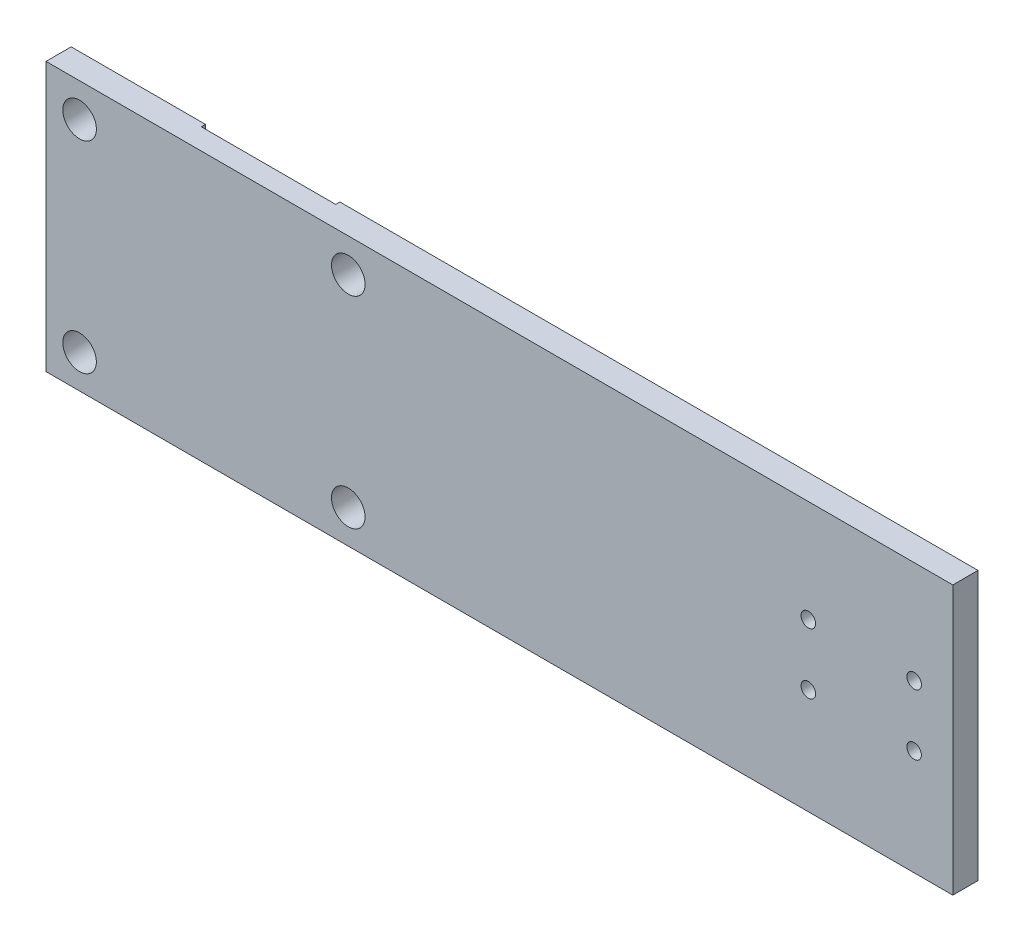
ISO-10303-21;
HEADER;
FILE_DESCRIPTION(('STEP AP214'),'2;1');
FILE_NAME('part.step','',(''),(''),'','','');
FILE_SCHEMA(('AUTOMOTIVE_DESIGN { 1 0 10303 214 1 1 1 1 }'));
ENDSEC;
DATA;
#1=APPLICATION_CONTEXT('core data for automotive mechanical design processes');
#2=APPLICATION_PROTOCOL_DEFINITION('international standard','automotive_design',2000,#1);
#3=PRODUCT_CONTEXT('',#1,'mechanical');
#4=PRODUCT('Part','Part','',(#3));
#5=PRODUCT_RELATED_PRODUCT_CATEGORY('part','',(#4));
#6=PRODUCT_DEFINITION_FORMATION('','',#4);
#7=PRODUCT_DEFINITION_CONTEXT('part definition',#1,'design');
#8=PRODUCT_DEFINITION('design','',#6,#7);
#9=PRODUCT_DEFINITION_SHAPE('','',#8);
#10=(LENGTH_UNIT() NAMED_UNIT(*) SI_UNIT(.MILLI.,.METRE.));
#11=(NAMED_UNIT(*) PLANE_ANGLE_UNIT() SI_UNIT($,.RADIAN.));
#12=(NAMED_UNIT(*) SI_UNIT($,.STERADIAN.) SOLID_ANGLE_UNIT());
#13=UNCERTAINTY_MEASURE_WITH_UNIT(LENGTH_MEASURE(1.E-05),#10,'distance_accuracy_value','');
#14=(GEOMETRIC_REPRESENTATION_CONTEXT(3) GLOBAL_UNCERTAINTY_ASSIGNED_CONTEXT((#13)) GLOBAL_UNIT_ASSIGNED_CONTEXT((#10,
#11,#12)) REPRESENTATION_CONTEXT('',''));
#15=CARTESIAN_POINT('',(0.,0.,0.));
#16=DIRECTION('',(0.,0.,1.));
#17=DIRECTION('',(1.,0.,0.));
#18=AXIS2_PLACEMENT_3D('',#15,#16,#17);
#19=CARTESIAN_POINT('',(0.,0.,9.525));
#20=DIRECTION('',(0.,0.,-1.));
#21=DIRECTION('',(-1.,0.,0.));
#22=AXIS2_PLACEMENT_3D('',#19,#20,#21);
#23=PLANE('',#22);
#24=CARTESIAN_POINT('',(328.2696,62.9412,9.525));
#25=DIRECTION('',(0.,0.,1.));
#26=DIRECTION('',(1.,0.,0.));
#27=AXIS2_PLACEMENT_3D('',#24,#25,#26);
#28=CIRCLE('',#27,2.74999999999997);
#29=CARTESIAN_POINT('',(331.0196,62.9412,9.525));
#30=VERTEX_POINT('',#29);
#31=EDGE_CURVE('E510',#30,#30,#28,.T.);
#32=ORIENTED_EDGE('',*,*,#31,.F.);
#33=EDGE_LOOP('',(#32));
#34=FACE_BOUND('',#33,.T.);
#35=CARTESIAN_POINT('',(328.2696,39.9288,9.525));
#36=DIRECTION('',(0.,0.,1.));
#37=DIRECTION('',(1.,0.,0.));
#38=AXIS2_PLACEMENT_3D('',#35,#36,#37);
#39=CIRCLE('',#38,2.74999999999997);
#40=CARTESIAN_POINT('',(331.0196,39.9288,9.525));
#41=VERTEX_POINT('',#40);
#42=EDGE_CURVE('E512',#41,#41,#39,.T.);
#43=ORIENTED_EDGE('',*,*,#42,.F.);
#44=EDGE_LOOP('',(#43));
#45=FACE_BOUND('',#44,.T.);
#46=CARTESIAN_POINT('',(288.2646,39.9288,9.525));
#47=DIRECTION('',(0.,0.,1.));
#48=DIRECTION('',(1.,0.,0.));
#49=AXIS2_PLACEMENT_3D('',#46,#47,#48);
#50=CIRCLE('',#49,2.74999999999997);
#51=CARTESIAN_POINT('',(291.0146,39.9288,9.525));
#52=VERTEX_POINT('',#51);
#53=EDGE_CURVE('E520',#52,#52,#50,.T.);
#54=ORIENTED_EDGE('',*,*,#53,.F.);
#55=EDGE_LOOP('',(#54));
#56=FACE_BOUND('',#55,.T.);
#57=CARTESIAN_POINT('',(12.7,12.7,9.525));
#58=DIRECTION('',(0.,0.,-1.));
#59=DIRECTION('',(1.,0.,0.));
#60=AXIS2_PLACEMENT_3D('',#57,#58,#59);
#61=CIRCLE('',#60,6.35);
#62=CARTESIAN_POINT('',(6.35000000000003,12.7,9.525));
#63=VERTEX_POINT('',#62);
#64=EDGE_CURVE('E210',#63,#63,#61,.T.);
#65=ORIENTED_EDGE('',*,*,#64,.T.);
#66=EDGE_LOOP('',(#65));
#67=FACE_BOUND('',#66,.T.);
#68=CARTESIAN_POINT('',(114.3,12.7,9.525));
#69=DIRECTION('',(0.,0.,-1.));
#70=DIRECTION('',(1.,0.,0.));
#71=AXIS2_PLACEMENT_3D('',#68,#69,#70);
#72=CIRCLE('',#71,6.35);
#73=CARTESIAN_POINT('',(107.95,12.7,9.525));
#74=VERTEX_POINT('',#73);
#75=EDGE_CURVE('E221',#74,#74,#72,.T.);
#76=ORIENTED_EDGE('',*,*,#75,.T.);
#77=EDGE_LOOP('',(#76));
#78=FACE_BOUND('',#77,.T.);
#79=CARTESIAN_POINT('',(114.3,88.9,9.525));
#80=DIRECTION('',(0.,0.,-1.));
#81=DIRECTION('',(-1.,0.,0.));
#82=AXIS2_PLACEMENT_3D('',#79,#80,#81);
#83=CIRCLE('',#82,6.34999999999999);
#84=CARTESIAN_POINT('',(107.95,88.9,9.525));
#85=VERTEX_POINT('',#84);
#86=EDGE_CURVE('E215',#85,#85,#83,.T.);
#87=ORIENTED_EDGE('',*,*,#86,.T.);
#88=EDGE_LOOP('',(#87));
#89=FACE_BOUND('',#88,.T.);
#90=CARTESIAN_POINT('',(12.7,88.9,9.525));
#91=DIRECTION('',(0.,0.,-1.));
#92=DIRECTION('',(-1.,0.,0.));
#93=AXIS2_PLACEMENT_3D('',#90,#91,#92);
#94=CIRCLE('',#93,6.35);
#95=CARTESIAN_POINT('',(6.35000000000004,88.9,9.525));
#96=VERTEX_POINT('',#95);
#97=EDGE_CURVE('E197',#96,#96,#94,.T.);
#98=ORIENTED_EDGE('',*,*,#97,.T.);
#99=EDGE_LOOP('',(#98));
#100=FACE_BOUND('',#99,.T.);
#101=DIRECTION('',(0.,-1.,0.));
#102=VECTOR('',#101,1.);
#103=CARTESIAN_POINT('',(0.,0.,9.525));
#104=LINE('',#103,#102);
#105=CARTESIAN_POINT('',(0.,101.6,9.525));
#106=VERTEX_POINT('',#105);
#107=CARTESIAN_POINT('',(0.,0.,9.525));
#108=VERTEX_POINT('',#107);
#109=EDGE_CURVE('E178',#106,#108,#104,.T.);
#110=ORIENTED_EDGE('',*,*,#109,.T.);
#111=DIRECTION('',(1.,0.,0.));
#112=VECTOR('',#111,1.);
#113=CARTESIAN_POINT('',(0.,0.,9.525));
#114=LINE('',#113,#112);
#115=CARTESIAN_POINT('',(342.9,0.,9.525));
#116=VERTEX_POINT('',#115);
#117=EDGE_CURVE('E92',#108,#116,#114,.T.);
#118=ORIENTED_EDGE('',*,*,#117,.T.);
#119=DIRECTION('',(0.,1.,0.));
#120=VECTOR('',#119,1.);
#121=CARTESIAN_POINT('',(342.9,0.,9.525));
#122=LINE('',#121,#120);
#123=CARTESIAN_POINT('',(342.9,101.6,9.525));
#124=VERTEX_POINT('',#123);
#125=EDGE_CURVE('E255',#116,#124,#122,.T.);
#126=ORIENTED_EDGE('',*,*,#125,.T.);
#127=DIRECTION('',(-1.,0.,0.));
#128=VECTOR('',#127,1.);
#129=CARTESIAN_POINT('',(0.,101.6,9.525));
#130=LINE('',#129,#128);
#131=EDGE_CURVE('E63',#124,#106,#130,.T.);
#132=ORIENTED_EDGE('',*,*,#131,.T.);
#133=EDGE_LOOP('',(#110,#118,#126,#132));
#134=FACE_BOUND('',#133,.T.);
#135=CARTESIAN_POINT('',(288.2646,62.9412,9.525));
#136=DIRECTION('',(0.,0.,1.));
#137=DIRECTION('',(1.,0.,0.));
#138=AXIS2_PLACEMENT_3D('',#135,#136,#137);
#139=CIRCLE('',#138,2.74999999999997);
#140=CARTESIAN_POINT('',(291.0146,62.9412,9.525));
#141=VERTEX_POINT('',#140);
#142=EDGE_CURVE('E526',#141,#141,#139,.T.);
#143=ORIENTED_EDGE('',*,*,#142,.F.);
#144=EDGE_LOOP('',(#143));
#145=FACE_BOUND('',#144,.T.);
#146=ADVANCED_FACE('F39',(#34,#45,#56,#67,#78,#89,#100,#134,#145),#23,.F.);
#147=CARTESIAN_POINT('',(0.,0.,0.));
#148=DIRECTION('',(0.,0.,-1.));
#149=DIRECTION('',(-1.,0.,0.));
#150=AXIS2_PLACEMENT_3D('',#147,#148,#149);
#151=PLANE('',#150);
#152=CARTESIAN_POINT('',(328.2696,62.9412,0.));
#153=DIRECTION('',(0.,0.,1.));
#154=DIRECTION('',(1.,0.,0.));
#155=AXIS2_PLACEMENT_3D('',#152,#153,#154);
#156=CIRCLE('',#155,2.74999999999997);
#157=CARTESIAN_POINT('',(331.0196,62.9412,0.));
#158=VERTEX_POINT('',#157);
#159=EDGE_CURVE('E508',#158,#158,#156,.T.);
#160=ORIENTED_EDGE('',*,*,#159,.T.);
#161=EDGE_LOOP('',(#160));
#162=FACE_BOUND('',#161,.T.);
#163=CARTESIAN_POINT('',(328.2696,39.9288,0.));
#164=DIRECTION('',(0.,0.,1.));
#165=DIRECTION('',(1.,0.,0.));
#166=AXIS2_PLACEMENT_3D('',#163,#164,#165);
#167=CIRCLE('',#166,2.74999999999997);
#168=CARTESIAN_POINT('',(331.0196,39.9288,0.));
#169=VERTEX_POINT('',#168);
#170=EDGE_CURVE('E517',#169,#169,#167,.T.);
#171=ORIENTED_EDGE('',*,*,#170,.T.);
#172=EDGE_LOOP('',(#171));
#173=FACE_BOUND('',#172,.T.);
#174=CARTESIAN_POINT('',(288.2646,39.9288,0.));
#175=DIRECTION('',(0.,0.,1.));
#176=DIRECTION('',(1.,0.,0.));
#177=AXIS2_PLACEMENT_3D('',#174,#175,#176);
#178=CIRCLE('',#177,2.74999999999997);
#179=CARTESIAN_POINT('',(291.0146,39.9288,0.));
#180=VERTEX_POINT('',#179);
#181=EDGE_CURVE('E523',#180,#180,#178,.T.);
#182=ORIENTED_EDGE('',*,*,#181,.T.);
#183=EDGE_LOOP('',(#182));
#184=FACE_BOUND('',#183,.T.);
#185=CARTESIAN_POINT('',(288.2646,62.9412,0.));
#186=DIRECTION('',(0.,0.,1.));
#187=DIRECTION('',(1.,0.,0.));
#188=AXIS2_PLACEMENT_3D('',#185,#186,#187);
#189=CIRCLE('',#188,2.74999999999997);
#190=CARTESIAN_POINT('',(291.0146,62.9412,0.));
#191=VERTEX_POINT('',#190);
#192=EDGE_CURVE('E149',#191,#191,#189,.T.);
#193=ORIENTED_EDGE('',*,*,#192,.T.);
#194=EDGE_LOOP('',(#193));
#195=FACE_BOUND('',#194,.T.);
#196=DIRECTION('',(0.,-1.,0.));
#197=VECTOR('',#196,1.);
#198=CARTESIAN_POINT('',(101.6,101.6,0.));
#199=LINE('',#198,#197);
#200=CARTESIAN_POINT('',(101.6,101.6,0.));
#201=VERTEX_POINT('',#200);
#202=CARTESIAN_POINT('',(101.6,76.2,0.));
#203=VERTEX_POINT('',#202);
#204=EDGE_CURVE('E148',#201,#203,#199,.T.);
#205=ORIENTED_EDGE('',*,*,#204,.F.);
#206=DIRECTION('',(-1.,0.,0.));
#207=VECTOR('',#206,1.);
#208=CARTESIAN_POINT('',(0.,101.6,0.));
#209=LINE('',#208,#207);
#210=CARTESIAN_POINT('',(342.9,101.6,0.));
#211=VERTEX_POINT('',#210);
#212=EDGE_CURVE('E175',#211,#201,#209,.T.);
#213=ORIENTED_EDGE('',*,*,#212,.F.);
#214=DIRECTION('',(0.,1.,0.));
#215=VECTOR('',#214,1.);
#216=CARTESIAN_POINT('',(342.9,0.,0.));
#217=LINE('',#216,#215);
#218=CARTESIAN_POINT('',(342.9,0.,0.));
#219=VERTEX_POINT('',#218);
#220=EDGE_CURVE('E164',#219,#211,#217,.T.);
#221=ORIENTED_EDGE('',*,*,#220,.F.);
#222=DIRECTION('',(1.,0.,0.));
#223=VECTOR('',#222,1.);
#224=CARTESIAN_POINT('',(0.,0.,0.));
#225=LINE('',#224,#223);
#226=CARTESIAN_POINT('',(101.6,0.,0.));
#227=VERTEX_POINT('',#226);
#228=EDGE_CURVE('E152',#227,#219,#225,.T.);
#229=ORIENTED_EDGE('',*,*,#228,.F.);
#230=CARTESIAN_POINT('',(101.6,25.4,0.));
#231=VERTEX_POINT('',#230);
#232=EDGE_CURVE('E138',#231,#227,#199,.T.);
#233=ORIENTED_EDGE('',*,*,#232,.F.);
#234=DIRECTION('',(-1.,0.,0.));
#235=VECTOR('',#234,1.);
#236=CARTESIAN_POINT('',(268.605,25.4,0.));
#237=LINE('',#236,#235);
#238=CARTESIAN_POINT('',(268.605,25.4,0.));
#239=VERTEX_POINT('',#238);
#240=EDGE_CURVE('E243',#239,#231,#237,.T.);
#241=ORIENTED_EDGE('',*,*,#240,.F.);
#242=DIRECTION('',(0.,1.,0.));
#243=VECTOR('',#242,1.);
#244=CARTESIAN_POINT('',(268.605,76.2,0.));
#245=LINE('',#244,#243);
#246=CARTESIAN_POINT('',(268.605,76.2,0.));
#247=VERTEX_POINT('',#246);
#248=EDGE_CURVE('E234',#239,#247,#245,.T.);
#249=ORIENTED_EDGE('',*,*,#248,.T.);
#250=DIRECTION('',(-1.,0.,0.));
#251=VECTOR('',#250,1.);
#252=CARTESIAN_POINT('',(268.605,76.2,0.));
#253=LINE('',#252,#251);
#254=EDGE_CURVE('E170',#247,#203,#253,.T.);
#255=ORIENTED_EDGE('',*,*,#254,.T.);
#256=EDGE_LOOP('',(#205,#213,#221,#229,#233,#241,#249,#255));
#257=FACE_BOUND('',#256,.T.);
#258=CARTESIAN_POINT('',(114.3,88.9,0.));
#259=DIRECTION('',(0.,0.,-1.));
#260=DIRECTION('',(-1.,0.,0.));
#261=AXIS2_PLACEMENT_3D('',#258,#259,#260);
#262=CIRCLE('',#261,6.34999999999999);
#263=CARTESIAN_POINT('',(107.95,88.9,0.));
#264=VERTEX_POINT('',#263);
#265=EDGE_CURVE('E211',#264,#264,#262,.T.);
#266=ORIENTED_EDGE('',*,*,#265,.F.);
#267=EDGE_LOOP('',(#266));
#268=FACE_BOUND('',#267,.T.);
#269=CARTESIAN_POINT('',(114.3,12.7,0.));
#270=DIRECTION('',(0.,0.,-1.));
#271=DIRECTION('',(1.,0.,0.));
#272=AXIS2_PLACEMENT_3D('',#269,#270,#271);
#273=CIRCLE('',#272,6.35);
#274=CARTESIAN_POINT('',(107.95,12.7,0.));
#275=VERTEX_POINT('',#274);
#276=EDGE_CURVE('E218',#275,#275,#273,.T.);
#277=ORIENTED_EDGE('',*,*,#276,.F.);
#278=EDGE_LOOP('',(#277));
#279=FACE_BOUND('',#278,.T.);
#280=ADVANCED_FACE('F161',(#162,#173,#184,#195,#257,#268,#279),#151,.T.);
#281=DIRECTION('',(0.,1.,0.));
#282=VECTOR('',#281,1.);
#283=CARTESIAN_POINT('',(50.8,76.2,0.));
#284=LINE('',#283,#282);
#285=CARTESIAN_POINT('',(50.8,0.,0.));
#286=VERTEX_POINT('',#285);
#287=CARTESIAN_POINT('',(50.8,101.6,0.));
#288=VERTEX_POINT('',#287);
#289=EDGE_CURVE('E192',#286,#288,#284,.T.);
#290=ORIENTED_EDGE('',*,*,#289,.F.);
#291=CARTESIAN_POINT('',(0.,0.,0.));
#292=VERTEX_POINT('',#291);
#293=EDGE_CURVE('E165',#292,#286,#225,.T.);
#294=ORIENTED_EDGE('',*,*,#293,.F.);
#295=DIRECTION('',(0.,-1.,0.));
#296=VECTOR('',#295,1.);
#297=CARTESIAN_POINT('',(0.,0.,0.));
#298=LINE('',#297,#296);
#299=CARTESIAN_POINT('',(0.,101.6,0.));
#300=VERTEX_POINT('',#299);
#301=EDGE_CURVE('E166',#300,#292,#298,.T.);
#302=ORIENTED_EDGE('',*,*,#301,.F.);
#303=EDGE_CURVE('E84',#288,#300,#209,.T.);
#304=ORIENTED_EDGE('',*,*,#303,.F.);
#305=EDGE_LOOP('',(#290,#294,#302,#304));
#306=FACE_BOUND('',#305,.T.);
#307=CARTESIAN_POINT('',(12.7,12.7,0.));
#308=DIRECTION('',(0.,0.,-1.));
#309=DIRECTION('',(1.,0.,0.));
#310=AXIS2_PLACEMENT_3D('',#307,#308,#309);
#311=CIRCLE('',#310,6.35);
#312=CARTESIAN_POINT('',(6.35000000000003,12.7,0.));
#313=VERTEX_POINT('',#312);
#314=EDGE_CURVE('E224',#313,#313,#311,.T.);
#315=ORIENTED_EDGE('',*,*,#314,.F.);
#316=EDGE_LOOP('',(#315));
#317=FACE_BOUND('',#316,.T.);
#318=CARTESIAN_POINT('',(12.7,88.9,0.));
#319=DIRECTION('',(0.,0.,-1.));
#320=DIRECTION('',(-1.,0.,0.));
#321=AXIS2_PLACEMENT_3D('',#318,#319,#320);
#322=CIRCLE('',#321,6.35);
#323=CARTESIAN_POINT('',(6.35000000000004,88.9,0.));
#324=VERTEX_POINT('',#323);
#325=EDGE_CURVE('E214',#324,#324,#322,.T.);
#326=ORIENTED_EDGE('',*,*,#325,.F.);
#327=EDGE_LOOP('',(#326));
#328=FACE_BOUND('',#327,.T.);
#329=ADVANCED_FACE('F190',(#306,#317,#328),#151,.T.);
#330=CARTESIAN_POINT('',(0.,0.,9.525));
#331=DIRECTION('',(1.,0.,0.));
#332=DIRECTION('',(0.,0.,-1.));
#333=AXIS2_PLACEMENT_3D('',#330,#331,#332);
#334=PLANE('',#333);
#335=ORIENTED_EDGE('',*,*,#301,.T.);
#336=DIRECTION('',(0.,0.,-1.));
#337=VECTOR('',#336,1.);
#338=CARTESIAN_POINT('',(0.,0.,9.525));
#339=LINE('',#338,#337);
#340=EDGE_CURVE('E47',#108,#292,#339,.T.);
#341=ORIENTED_EDGE('',*,*,#340,.F.);
#342=ORIENTED_EDGE('',*,*,#109,.F.);
#343=DIRECTION('',(0.,0.,-1.));
#344=VECTOR('',#343,1.);
#345=CARTESIAN_POINT('',(0.,101.6,9.525));
#346=LINE('',#345,#344);
#347=EDGE_CURVE('E179',#106,#300,#346,.T.);
#348=ORIENTED_EDGE('',*,*,#347,.T.);
#349=EDGE_LOOP('',(#335,#341,#342,#348));
#350=FACE_BOUND('',#349,.T.);
#351=ADVANCED_FACE('F41',(#350),#334,.F.);
#352=CARTESIAN_POINT('',(0.,0.,9.525));
#353=DIRECTION('',(0.,1.,0.));
#354=DIRECTION('',(0.,0.,1.));
#355=AXIS2_PLACEMENT_3D('',#352,#353,#354);
#356=PLANE('',#355);
#357=DIRECTION('',(1.,0.,0.));
#358=VECTOR('',#357,1.);
#359=CARTESIAN_POINT('',(101.6,0.,1.58749999999999));
#360=LINE('',#359,#358);
#361=CARTESIAN_POINT('',(50.8,0.,1.58749999999999));
#362=VERTEX_POINT('',#361);
#363=CARTESIAN_POINT('',(101.6,0.,1.58749999999999));
#364=VERTEX_POINT('',#363);
#365=EDGE_CURVE('E156',#362,#364,#360,.T.);
#366=ORIENTED_EDGE('',*,*,#365,.T.);
#367=DIRECTION('',(0.,0.,-1.));
#368=VECTOR('',#367,1.);
#369=CARTESIAN_POINT('',(101.6,0.,115.179753256989));
#370=LINE('',#369,#368);
#371=EDGE_CURVE('E141',#364,#227,#370,.T.);
#372=ORIENTED_EDGE('',*,*,#371,.T.);
#373=ORIENTED_EDGE('',*,*,#228,.T.);
#374=DIRECTION('',(0.,0.,-1.));
#375=VECTOR('',#374,1.);
#376=CARTESIAN_POINT('',(342.9,0.,9.525));
#377=LINE('',#376,#375);
#378=EDGE_CURVE('E184',#116,#219,#377,.T.);
#379=ORIENTED_EDGE('',*,*,#378,.F.);
#380=ORIENTED_EDGE('',*,*,#117,.F.);
#381=ORIENTED_EDGE('',*,*,#340,.T.);
#382=ORIENTED_EDGE('',*,*,#293,.T.);
#383=DIRECTION('',(0.,0.,-1.));
#384=VECTOR('',#383,1.);
#385=CARTESIAN_POINT('',(50.8,0.,115.179753256989));
#386=LINE('',#385,#384);
#387=EDGE_CURVE('E157',#362,#286,#386,.T.);
#388=ORIENTED_EDGE('',*,*,#387,.F.);
#389=EDGE_LOOP('',(#366,#372,#373,#379,#380,#381,#382,#388));
#390=FACE_BOUND('',#389,.T.);
#391=ADVANCED_FACE('F151',(#390),#356,.F.);
#392=CARTESIAN_POINT('',(342.9,0.,9.525));
#393=DIRECTION('',(-1.,0.,0.));
#394=DIRECTION('',(0.,0.,1.));
#395=AXIS2_PLACEMENT_3D('',#392,#393,#394);
#396=PLANE('',#395);
#397=ORIENTED_EDGE('',*,*,#220,.T.);
#398=DIRECTION('',(0.,0.,-1.));
#399=VECTOR('',#398,1.);
#400=CARTESIAN_POINT('',(342.9,101.6,9.525));
#401=LINE('',#400,#399);
#402=EDGE_CURVE('E181',#124,#211,#401,.T.);
#403=ORIENTED_EDGE('',*,*,#402,.F.);
#404=ORIENTED_EDGE('',*,*,#125,.F.);
#405=ORIENTED_EDGE('',*,*,#378,.T.);
#406=EDGE_LOOP('',(#397,#403,#404,#405));
#407=FACE_BOUND('',#406,.T.);
#408=ADVANCED_FACE('F260',(#407),#396,.F.);
#409=CARTESIAN_POINT('',(0.,101.6,9.525));
#410=DIRECTION('',(0.,-1.,0.));
#411=DIRECTION('',(0.,0.,-1.));
#412=AXIS2_PLACEMENT_3D('',#409,#410,#411);
#413=PLANE('',#412);
#414=ORIENTED_EDGE('',*,*,#212,.T.);
#415=DIRECTION('',(0.,0.,-1.));
#416=VECTOR('',#415,1.);
#417=CARTESIAN_POINT('',(101.6,101.6,115.179753256989));
#418=LINE('',#417,#416);
#419=CARTESIAN_POINT('',(101.6,101.6,1.58750000000001));
#420=VERTEX_POINT('',#419);
#421=EDGE_CURVE('E202',#420,#201,#418,.T.);
#422=ORIENTED_EDGE('',*,*,#421,.F.);
#423=DIRECTION('',(-1.,0.,0.));
#424=VECTOR('',#423,1.);
#425=CARTESIAN_POINT('',(101.6,101.6,1.58750000000001));
#426=LINE('',#425,#424);
#427=CARTESIAN_POINT('',(50.8,101.6,1.58750000000001));
#428=VERTEX_POINT('',#427);
#429=EDGE_CURVE('E531',#420,#428,#426,.T.);
#430=ORIENTED_EDGE('',*,*,#429,.T.);
#431=DIRECTION('',(0.,0.,-1.));
#432=VECTOR('',#431,1.);
#433=CARTESIAN_POINT('',(50.8,101.6,115.179753256989));
#434=LINE('',#433,#432);
#435=EDGE_CURVE('E200',#428,#288,#434,.T.);
#436=ORIENTED_EDGE('',*,*,#435,.T.);
#437=ORIENTED_EDGE('',*,*,#303,.T.);
#438=ORIENTED_EDGE('',*,*,#347,.F.);
#439=ORIENTED_EDGE('',*,*,#131,.F.);
#440=ORIENTED_EDGE('',*,*,#402,.T.);
#441=EDGE_LOOP('',(#414,#422,#430,#436,#437,#438,#439,#440));
#442=FACE_BOUND('',#441,.T.);
#443=ADVANCED_FACE('F261',(#442),#413,.F.);
#444=CARTESIAN_POINT('',(268.605,76.2,0.));
#445=DIRECTION('',(0.,-1.,0.));
#446=DIRECTION('',(0.,0.,-1.));
#447=AXIS2_PLACEMENT_3D('',#444,#445,#446);
#448=PLANE('',#447);
#449=DIRECTION('',(0.,0.,1.));
#450=VECTOR('',#449,1.);
#451=CARTESIAN_POINT('',(101.6,76.2,0.));
#452=LINE('',#451,#450);
#453=CARTESIAN_POINT('',(101.6,76.2,1.5875));
#454=VERTEX_POINT('',#453);
#455=EDGE_CURVE('E207',#203,#454,#452,.T.);
#456=ORIENTED_EDGE('',*,*,#455,.F.);
#457=ORIENTED_EDGE('',*,*,#254,.F.);
#458=DIRECTION('',(0.,0.,1.));
#459=VECTOR('',#458,1.);
#460=CARTESIAN_POINT('',(268.605,76.2,0.));
#461=LINE('',#460,#459);
#462=CARTESIAN_POINT('',(268.605,76.2,1.5875));
#463=VERTEX_POINT('',#462);
#464=EDGE_CURVE('E237',#247,#463,#461,.T.);
#465=ORIENTED_EDGE('',*,*,#464,.T.);
#466=DIRECTION('',(-1.,0.,0.));
#467=VECTOR('',#466,1.);
#468=CARTESIAN_POINT('',(268.605,76.2,1.5875));
#469=LINE('',#468,#467);
#470=EDGE_CURVE('E248',#463,#454,#469,.T.);
#471=ORIENTED_EDGE('',*,*,#470,.T.);
#472=EDGE_LOOP('',(#456,#457,#465,#471));
#473=FACE_BOUND('',#472,.T.);
#474=ADVANCED_FACE('F264',(#473),#448,.T.);
#475=CARTESIAN_POINT('',(268.605,76.2,1.5875));
#476=DIRECTION('',(0.,0.,-1.));
#477=DIRECTION('',(0.,1.,0.));
#478=AXIS2_PLACEMENT_3D('',#475,#476,#477);
#479=PLANE('',#478);
#480=DIRECTION('',(-1.,0.,0.));
#481=VECTOR('',#480,1.);
#482=CARTESIAN_POINT('',(268.605,25.4,1.58749999999999));
#483=LINE('',#482,#481);
#484=CARTESIAN_POINT('',(268.605,25.4,1.58749999999999));
#485=VERTEX_POINT('',#484);
#486=CARTESIAN_POINT('',(101.6,25.4,1.5875));
#487=VERTEX_POINT('',#486);
#488=EDGE_CURVE('E245',#485,#487,#483,.T.);
#489=ORIENTED_EDGE('',*,*,#488,.T.);
#490=DIRECTION('',(0.,1.,0.));
#491=VECTOR('',#490,1.);
#492=CARTESIAN_POINT('',(101.6,101.6,1.58750000000001));
#493=LINE('',#492,#491);
#494=EDGE_CURVE('E208',#364,#487,#493,.T.);
#495=ORIENTED_EDGE('',*,*,#494,.F.);
#496=ORIENTED_EDGE('',*,*,#365,.F.);
#497=DIRECTION('',(0.,-1.,0.));
#498=VECTOR('',#497,1.);
#499=CARTESIAN_POINT('',(50.8,76.2,1.5875));
#500=LINE('',#499,#498);
#501=EDGE_CURVE('E196',#428,#362,#500,.T.);
#502=ORIENTED_EDGE('',*,*,#501,.F.);
#503=ORIENTED_EDGE('',*,*,#429,.F.);
#504=EDGE_CURVE('E54',#454,#420,#493,.T.);
#505=ORIENTED_EDGE('',*,*,#504,.F.);
#506=ORIENTED_EDGE('',*,*,#470,.F.);
#507=DIRECTION('',(0.,-1.,0.));
#508=VECTOR('',#507,1.);
#509=CARTESIAN_POINT('',(268.605,76.2,1.5875));
#510=LINE('',#509,#508);
#511=EDGE_CURVE('E239',#463,#485,#510,.T.);
#512=ORIENTED_EDGE('',*,*,#511,.T.);
#513=EDGE_LOOP('',(#489,#495,#496,#502,#503,#505,#506,#512));
#514=FACE_BOUND('',#513,.T.);
#515=ADVANCED_FACE('F270',(#514),#479,.T.);
#516=CARTESIAN_POINT('',(268.605,25.4,0.));
#517=DIRECTION('',(0.,1.,0.));
#518=DIRECTION('',(0.,0.,1.));
#519=AXIS2_PLACEMENT_3D('',#516,#517,#518);
#520=PLANE('',#519);
#521=DIRECTION('',(0.,0.,-1.));
#522=VECTOR('',#521,1.);
#523=CARTESIAN_POINT('',(101.6,25.4,0.));
#524=LINE('',#523,#522);
#525=EDGE_CURVE('E11',#487,#231,#524,.T.);
#526=ORIENTED_EDGE('',*,*,#525,.F.);
#527=ORIENTED_EDGE('',*,*,#488,.F.);
#528=DIRECTION('',(0.,0.,-1.));
#529=VECTOR('',#528,1.);
#530=CARTESIAN_POINT('',(268.605,25.4,0.));
#531=LINE('',#530,#529);
#532=EDGE_CURVE('E241',#485,#239,#531,.T.);
#533=ORIENTED_EDGE('',*,*,#532,.T.);
#534=ORIENTED_EDGE('',*,*,#240,.T.);
#535=EDGE_LOOP('',(#526,#527,#533,#534));
#536=FACE_BOUND('',#535,.T.);
#537=ADVANCED_FACE('F312',(#536),#520,.T.);
#538=CARTESIAN_POINT('',(268.605,0.,0.));
#539=DIRECTION('',(-1.,0.,0.));
#540=DIRECTION('',(0.,0.,1.));
#541=AXIS2_PLACEMENT_3D('',#538,#539,#540);
#542=PLANE('',#541);
#543=ORIENTED_EDGE('',*,*,#248,.F.);
#544=ORIENTED_EDGE('',*,*,#532,.F.);
#545=ORIENTED_EDGE('',*,*,#511,.F.);
#546=ORIENTED_EDGE('',*,*,#464,.F.);
#547=EDGE_LOOP('',(#543,#544,#545,#546));
#548=FACE_BOUND('',#547,.T.);
#549=ADVANCED_FACE('F307',(#548),#542,.T.);
#550=CARTESIAN_POINT('',(50.8,0.,0.));
#551=DIRECTION('',(-1.,0.,0.));
#552=DIRECTION('',(0.,0.,1.));
#553=AXIS2_PLACEMENT_3D('',#550,#551,#552);
#554=PLANE('',#553);
#555=ORIENTED_EDGE('',*,*,#289,.T.);
#556=ORIENTED_EDGE('',*,*,#435,.F.);
#557=ORIENTED_EDGE('',*,*,#501,.T.);
#558=ORIENTED_EDGE('',*,*,#387,.T.);
#559=EDGE_LOOP('',(#555,#556,#557,#558));
#560=FACE_BOUND('',#559,.T.);
#561=ADVANCED_FACE('F199',(#560),#554,.F.);
#562=CARTESIAN_POINT('',(12.7,88.9,9.525));
#563=DIRECTION('',(0.,0.,-1.));
#564=DIRECTION('',(-1.,0.,0.));
#565=AXIS2_PLACEMENT_3D('',#562,#563,#564);
#566=CYLINDRICAL_SURFACE('',#565,6.35);
#567=CARTESIAN_POINT('',(6.35000000000004,88.9,9.525));
#568=CARTESIAN_POINT('',(6.35000000000004,88.9,9.42578125));
#569=CARTESIAN_POINT('',(6.35000000000004,88.9,9.3265625));
#570=CARTESIAN_POINT('',(6.35000000000004,88.9,9.128125));
#571=CARTESIAN_POINT('',(6.35000000000004,88.9,9.02890625));
#572=CARTESIAN_POINT('',(6.35000000000004,88.9,8.83046875));
#573=CARTESIAN_POINT('',(6.35000000000004,88.9,8.73125));
#574=CARTESIAN_POINT('',(6.35000000000004,88.9,8.5328125));
#575=CARTESIAN_POINT('',(6.35000000000004,88.9,8.43359375));
#576=CARTESIAN_POINT('',(6.35000000000004,88.9,8.23515625));
#577=CARTESIAN_POINT('',(6.35000000000004,88.9,8.1359375));
#578=CARTESIAN_POINT('',(6.35000000000004,88.9,7.9375));
#579=CARTESIAN_POINT('',(6.35000000000004,88.9,7.83828125));
#580=CARTESIAN_POINT('',(6.35000000000004,88.9,7.63984375));
#581=CARTESIAN_POINT('',(6.35000000000004,88.9,7.540625));
#582=CARTESIAN_POINT('',(6.35000000000004,88.9,7.3421875));
#583=CARTESIAN_POINT('',(6.35000000000004,88.9,7.24296875));
#584=CARTESIAN_POINT('',(6.35000000000004,88.9,7.04453125));
#585=CARTESIAN_POINT('',(6.35000000000004,88.9,6.9453125));
#586=CARTESIAN_POINT('',(6.35000000000004,88.9,6.746875));
#587=CARTESIAN_POINT('',(6.35000000000004,88.9,6.64765625));
#588=CARTESIAN_POINT('',(6.35000000000004,88.9,6.44921875));
#589=CARTESIAN_POINT('',(6.35000000000004,88.9,6.35));
#590=CARTESIAN_POINT('',(6.35000000000004,88.9,6.1515625));
#591=CARTESIAN_POINT('',(6.35000000000004,88.9,6.05234375));
#592=CARTESIAN_POINT('',(6.35000000000004,88.9,5.85390625));
#593=CARTESIAN_POINT('',(6.35000000000004,88.9,5.7546875));
#594=CARTESIAN_POINT('',(6.35000000000004,88.9,5.55625));
#595=CARTESIAN_POINT('',(6.35000000000004,88.9,5.45703125));
#596=CARTESIAN_POINT('',(6.35000000000004,88.9,5.25859375));
#597=CARTESIAN_POINT('',(6.35000000000004,88.9,5.159375));
#598=CARTESIAN_POINT('',(6.35000000000004,88.9,4.9609375));
#599=CARTESIAN_POINT('',(6.35000000000004,88.9,4.86171875));
#600=CARTESIAN_POINT('',(6.35000000000004,88.9,4.66328125));
#601=CARTESIAN_POINT('',(6.35000000000004,88.9,4.5640625));
#602=CARTESIAN_POINT('',(6.35000000000004,88.9,4.365625));
#603=CARTESIAN_POINT('',(6.35000000000004,88.9,4.26640625));
#604=CARTESIAN_POINT('',(6.35000000000004,88.9,4.06796875));
#605=CARTESIAN_POINT('',(6.35000000000004,88.9,3.96875));
#606=CARTESIAN_POINT('',(6.35000000000004,88.9,3.7703125));
#607=CARTESIAN_POINT('',(6.35000000000004,88.9,3.67109375));
#608=CARTESIAN_POINT('',(6.35000000000004,88.9,3.47265625));
#609=CARTESIAN_POINT('',(6.35000000000004,88.9,3.3734375));
#610=CARTESIAN_POINT('',(6.35000000000004,88.9,3.175));
#611=CARTESIAN_POINT('',(6.35000000000004,88.9,3.07578125));
#612=CARTESIAN_POINT('',(6.35000000000004,88.9,2.87734375));
#613=CARTESIAN_POINT('',(6.35000000000004,88.9,2.778125));
#614=CARTESIAN_POINT('',(6.35000000000004,88.9,2.5796875));
#615=CARTESIAN_POINT('',(6.35000000000004,88.9,2.48046875));
#616=CARTESIAN_POINT('',(6.35000000000004,88.9,2.28203125));
#617=CARTESIAN_POINT('',(6.35000000000004,88.9,2.1828125));
#618=CARTESIAN_POINT('',(6.35000000000004,88.9,1.984375));
#619=CARTESIAN_POINT('',(6.35000000000004,88.9,1.88515625));
#620=CARTESIAN_POINT('',(6.35000000000004,88.9,1.68671875));
#621=CARTESIAN_POINT('',(6.35000000000004,88.9,1.5875));
#622=CARTESIAN_POINT('',(6.35000000000004,88.9,1.3890625));
#623=CARTESIAN_POINT('',(6.35000000000004,88.9,1.28984375));
#624=CARTESIAN_POINT('',(6.35000000000004,88.9,1.09140625));
#625=CARTESIAN_POINT('',(6.35000000000004,88.9,0.992187500000001));
#626=CARTESIAN_POINT('',(6.35000000000004,88.9,0.793750000000001));
#627=CARTESIAN_POINT('',(6.35000000000004,88.9,0.69453125));
#628=CARTESIAN_POINT('',(6.35000000000004,88.9,0.49609375));
#629=CARTESIAN_POINT('',(6.35000000000004,88.9,0.396875));
#630=CARTESIAN_POINT('',(6.35000000000004,88.9,0.1984375));
#631=CARTESIAN_POINT('',(6.35000000000004,88.9,0.0992187500000001));
#632=CARTESIAN_POINT('',(6.35000000000004,88.9,0.));
#633=B_SPLINE_CURVE_WITH_KNOTS('',3,(#567,#568,#569,#570,#571,#572,#573,#574,#575,#576,#577,
#578,#579,#580,#581,#582,#583,#584,#585,#586,#587,#588,#589,#590,#591,#592,#593,#594,#595,#596,
#597,#598,#599,#600,#601,#602,#603,#604,#605,#606,#607,#608,#609,#610,#611,#612,#613,#614,#615,
#616,#617,#618,#619,#620,#621,#622,#623,#624,#625,#626,#627,#628,#629,#630,#631,#632),
.UNSPECIFIED.,.F.,.F.,(4,2,2,2,2,2,2,2,2,2,2,2,2,2,2,2,2,2,2,2,2,2,2,2,2,2,2,2,2,2,2,2,4),(0.,
0.29765625,0.5953125,0.892968750000001,1.190625,1.48828125,1.7859375,2.08359375,2.38125,
2.67890625,2.9765625,3.27421875,3.571875,3.86953125,4.1671875,4.46484375,4.7625,5.06015625,
5.3578125,5.65546875,5.953125,6.25078125,6.5484375,6.84609375,7.14375,7.44140625,7.7390625,
8.03671875,8.334375,8.63203125,8.9296875,9.22734375,9.525),.UNSPECIFIED.);
#634=EDGE_CURVE('BSEAM323',#96,#324,#633,.T.);
#635=ORIENTED_EDGE('',*,*,#97,.F.);
#636=ORIENTED_EDGE('',*,*,#325,.T.);
#637=ORIENTED_EDGE('',*,*,#634,.T.);
#638=ORIENTED_EDGE('',*,*,#634,.F.);
#639=EDGE_LOOP('',(#635,#637,#636,#638));
#640=FACE_BOUND('',#639,.T.);
#641=ADVANCED_FACE('F323',(#640),#566,.F.);
#642=CARTESIAN_POINT('',(114.3,88.9,9.525));
#643=DIRECTION('',(0.,0.,-1.));
#644=DIRECTION('',(-1.,0.,0.));
#645=AXIS2_PLACEMENT_3D('',#642,#643,#644);
#646=CYLINDRICAL_SURFACE('',#645,6.34999999999999);
#647=CARTESIAN_POINT('',(107.95,88.9,9.525));
#648=CARTESIAN_POINT('',(107.95,88.9,9.42578125));
#649=CARTESIAN_POINT('',(107.95,88.9,9.3265625));
#650=CARTESIAN_POINT('',(107.95,88.9,9.128125));
#651=CARTESIAN_POINT('',(107.95,88.9,9.02890625));
#652=CARTESIAN_POINT('',(107.95,88.9,8.83046875));
#653=CARTESIAN_POINT('',(107.95,88.9,8.73125));
#654=CARTESIAN_POINT('',(107.95,88.9,8.5328125));
#655=CARTESIAN_POINT('',(107.95,88.9,8.43359375));
#656=CARTESIAN_POINT('',(107.95,88.9,8.23515625));
#657=CARTESIAN_POINT('',(107.95,88.9,8.1359375));
#658=CARTESIAN_POINT('',(107.95,88.9,7.9375));
#659=CARTESIAN_POINT('',(107.95,88.9,7.83828125));
#660=CARTESIAN_POINT('',(107.95,88.9,7.63984375));
#661=CARTESIAN_POINT('',(107.95,88.9,7.540625));
#662=CARTESIAN_POINT('',(107.95,88.9,7.3421875));
#663=CARTESIAN_POINT('',(107.95,88.9,7.24296875));
#664=CARTESIAN_POINT('',(107.95,88.9,7.04453125));
#665=CARTESIAN_POINT('',(107.95,88.9,6.9453125));
#666=CARTESIAN_POINT('',(107.95,88.9,6.746875));
#667=CARTESIAN_POINT('',(107.95,88.9,6.64765625));
#668=CARTESIAN_POINT('',(107.95,88.9,6.44921875));
#669=CARTESIAN_POINT('',(107.95,88.9,6.35));
#670=CARTESIAN_POINT('',(107.95,88.9,6.1515625));
#671=CARTESIAN_POINT('',(107.95,88.9,6.05234375));
#672=CARTESIAN_POINT('',(107.95,88.9,5.85390625));
#673=CARTESIAN_POINT('',(107.95,88.9,5.7546875));
#674=CARTESIAN_POINT('',(107.95,88.9,5.55625));
#675=CARTESIAN_POINT('',(107.95,88.9,5.45703125));
#676=CARTESIAN_POINT('',(107.95,88.9,5.25859375));
#677=CARTESIAN_POINT('',(107.95,88.9,5.159375));
#678=CARTESIAN_POINT('',(107.95,88.9,4.9609375));
#679=CARTESIAN_POINT('',(107.95,88.9,4.86171875));
#680=CARTESIAN_POINT('',(107.95,88.9,4.66328125));
#681=CARTESIAN_POINT('',(107.95,88.9,4.5640625));
#682=CARTESIAN_POINT('',(107.95,88.9,4.365625));
#683=CARTESIAN_POINT('',(107.95,88.9,4.26640625));
#684=CARTESIAN_POINT('',(107.95,88.9,4.06796875));
#685=CARTESIAN_POINT('',(107.95,88.9,3.96875));
#686=CARTESIAN_POINT('',(107.95,88.9,3.7703125));
#687=CARTESIAN_POINT('',(107.95,88.9,3.67109375));
#688=CARTESIAN_POINT('',(107.95,88.9,3.47265625));
#689=CARTESIAN_POINT('',(107.95,88.9,3.3734375));
#690=CARTESIAN_POINT('',(107.95,88.9,3.175));
#691=CARTESIAN_POINT('',(107.95,88.9,3.07578125));
#692=CARTESIAN_POINT('',(107.95,88.9,2.87734375));
#693=CARTESIAN_POINT('',(107.95,88.9,2.778125));
#694=CARTESIAN_POINT('',(107.95,88.9,2.5796875));
#695=CARTESIAN_POINT('',(107.95,88.9,2.48046875));
#696=CARTESIAN_POINT('',(107.95,88.9,2.28203125));
#697=CARTESIAN_POINT('',(107.95,88.9,2.1828125));
#698=CARTESIAN_POINT('',(107.95,88.9,1.984375));
#699=CARTESIAN_POINT('',(107.95,88.9,1.88515625));
#700=CARTESIAN_POINT('',(107.95,88.9,1.68671875));
#701=CARTESIAN_POINT('',(107.95,88.9,1.5875));
#702=CARTESIAN_POINT('',(107.95,88.9,1.3890625));
#703=CARTESIAN_POINT('',(107.95,88.9,1.28984375));
#704=CARTESIAN_POINT('',(107.95,88.9,1.09140625));
#705=CARTESIAN_POINT('',(107.95,88.9,0.992187500000001));
#706=CARTESIAN_POINT('',(107.95,88.9,0.793750000000001));
#707=CARTESIAN_POINT('',(107.95,88.9,0.69453125));
#708=CARTESIAN_POINT('',(107.95,88.9,0.49609375));
#709=CARTESIAN_POINT('',(107.95,88.9,0.396875));
#710=CARTESIAN_POINT('',(107.95,88.9,0.1984375));
#711=CARTESIAN_POINT('',(107.95,88.9,0.0992187500000001));
#712=CARTESIAN_POINT('',(107.95,88.9,0.));
#713=B_SPLINE_CURVE_WITH_KNOTS('',3,(#647,#648,#649,#650,#651,#652,#653,#654,#655,#656,#657,
#658,#659,#660,#661,#662,#663,#664,#665,#666,#667,#668,#669,#670,#671,#672,#673,#674,#675,#676,
#677,#678,#679,#680,#681,#682,#683,#684,#685,#686,#687,#688,#689,#690,#691,#692,#693,#694,#695,
#696,#697,#698,#699,#700,#701,#702,#703,#704,#705,#706,#707,#708,#709,#710,#711,#712),
.UNSPECIFIED.,.F.,.F.,(4,2,2,2,2,2,2,2,2,2,2,2,2,2,2,2,2,2,2,2,2,2,2,2,2,2,2,2,2,2,2,2,4),(0.,
0.29765625,0.5953125,0.892968750000001,1.190625,1.48828125,1.7859375,2.08359375,2.38125,
2.67890625,2.9765625,3.27421875,3.571875,3.86953125,4.1671875,4.46484375,4.7625,5.06015625,
5.3578125,5.65546875,5.953125,6.25078125,6.5484375,6.84609375,7.14375,7.44140625,7.7390625,
8.03671875,8.334375,8.63203125,8.9296875,9.22734375,9.525),.UNSPECIFIED.);
#714=EDGE_CURVE('BSEAM328',#85,#264,#713,.T.);
#715=ORIENTED_EDGE('',*,*,#86,.F.);
#716=ORIENTED_EDGE('',*,*,#265,.T.);
#717=ORIENTED_EDGE('',*,*,#714,.T.);
#718=ORIENTED_EDGE('',*,*,#714,.F.);
#719=EDGE_LOOP('',(#715,#717,#716,#718));
#720=FACE_BOUND('',#719,.T.);
#721=ADVANCED_FACE('F328',(#720),#646,.F.);
#722=CARTESIAN_POINT('',(114.3,12.7,9.525));
#723=DIRECTION('',(0.,0.,-1.));
#724=DIRECTION('',(-1.,0.,0.));
#725=AXIS2_PLACEMENT_3D('',#722,#723,#724);
#726=CYLINDRICAL_SURFACE('',#725,6.35);
#727=CARTESIAN_POINT('',(107.95,12.7,9.525));
#728=CARTESIAN_POINT('',(107.95,12.7,9.42578125));
#729=CARTESIAN_POINT('',(107.95,12.7,9.3265625));
#730=CARTESIAN_POINT('',(107.95,12.7,9.128125));
#731=CARTESIAN_POINT('',(107.95,12.7,9.02890625));
#732=CARTESIAN_POINT('',(107.95,12.7,8.83046875));
#733=CARTESIAN_POINT('',(107.95,12.7,8.73125));
#734=CARTESIAN_POINT('',(107.95,12.7,8.5328125));
#735=CARTESIAN_POINT('',(107.95,12.7,8.43359375));
#736=CARTESIAN_POINT('',(107.95,12.7,8.23515625));
#737=CARTESIAN_POINT('',(107.95,12.7,8.1359375));
#738=CARTESIAN_POINT('',(107.95,12.7,7.9375));
#739=CARTESIAN_POINT('',(107.95,12.7,7.83828125));
#740=CARTESIAN_POINT('',(107.95,12.7,7.63984375));
#741=CARTESIAN_POINT('',(107.95,12.7,7.540625));
#742=CARTESIAN_POINT('',(107.95,12.7,7.3421875));
#743=CARTESIAN_POINT('',(107.95,12.7,7.24296875));
#744=CARTESIAN_POINT('',(107.95,12.7,7.04453125));
#745=CARTESIAN_POINT('',(107.95,12.7,6.9453125));
#746=CARTESIAN_POINT('',(107.95,12.7,6.746875));
#747=CARTESIAN_POINT('',(107.95,12.7,6.64765625));
#748=CARTESIAN_POINT('',(107.95,12.7,6.44921875));
#749=CARTESIAN_POINT('',(107.95,12.7,6.35));
#750=CARTESIAN_POINT('',(107.95,12.7,6.1515625));
#751=CARTESIAN_POINT('',(107.95,12.7,6.05234375));
#752=CARTESIAN_POINT('',(107.95,12.7,5.85390625));
#753=CARTESIAN_POINT('',(107.95,12.7,5.7546875));
#754=CARTESIAN_POINT('',(107.95,12.7,5.55625));
#755=CARTESIAN_POINT('',(107.95,12.7,5.45703125));
#756=CARTESIAN_POINT('',(107.95,12.7,5.25859375));
#757=CARTESIAN_POINT('',(107.95,12.7,5.159375));
#758=CARTESIAN_POINT('',(107.95,12.7,4.9609375));
#759=CARTESIAN_POINT('',(107.95,12.7,4.86171875));
#760=CARTESIAN_POINT('',(107.95,12.7,4.66328125));
#761=CARTESIAN_POINT('',(107.95,12.7,4.5640625));
#762=CARTESIAN_POINT('',(107.95,12.7,4.365625));
#763=CARTESIAN_POINT('',(107.95,12.7,4.26640625));
#764=CARTESIAN_POINT('',(107.95,12.7,4.06796875));
#765=CARTESIAN_POINT('',(107.95,12.7,3.96875));
#766=CARTESIAN_POINT('',(107.95,12.7,3.7703125));
#767=CARTESIAN_POINT('',(107.95,12.7,3.67109375));
#768=CARTESIAN_POINT('',(107.95,12.7,3.47265625));
#769=CARTESIAN_POINT('',(107.95,12.7,3.3734375));
#770=CARTESIAN_POINT('',(107.95,12.7,3.175));
#771=CARTESIAN_POINT('',(107.95,12.7,3.07578125));
#772=CARTESIAN_POINT('',(107.95,12.7,2.87734375));
#773=CARTESIAN_POINT('',(107.95,12.7,2.778125));
#774=CARTESIAN_POINT('',(107.95,12.7,2.5796875));
#775=CARTESIAN_POINT('',(107.95,12.7,2.48046875));
#776=CARTESIAN_POINT('',(107.95,12.7,2.28203125));
#777=CARTESIAN_POINT('',(107.95,12.7,2.1828125));
#778=CARTESIAN_POINT('',(107.95,12.7,1.984375));
#779=CARTESIAN_POINT('',(107.95,12.7,1.88515625));
#780=CARTESIAN_POINT('',(107.95,12.7,1.68671875));
#781=CARTESIAN_POINT('',(107.95,12.7,1.5875));
#782=CARTESIAN_POINT('',(107.95,12.7,1.3890625));
#783=CARTESIAN_POINT('',(107.95,12.7,1.28984375));
#784=CARTESIAN_POINT('',(107.95,12.7,1.09140625));
#785=CARTESIAN_POINT('',(107.95,12.7,0.992187500000001));
#786=CARTESIAN_POINT('',(107.95,12.7,0.793750000000001));
#787=CARTESIAN_POINT('',(107.95,12.7,0.69453125));
#788=CARTESIAN_POINT('',(107.95,12.7,0.49609375));
#789=CARTESIAN_POINT('',(107.95,12.7,0.396875));
#790=CARTESIAN_POINT('',(107.95,12.7,0.1984375));
#791=CARTESIAN_POINT('',(107.95,12.7,0.0992187500000001));
#792=CARTESIAN_POINT('',(107.95,12.7,0.));
#793=B_SPLINE_CURVE_WITH_KNOTS('',3,(#727,#728,#729,#730,#731,#732,#733,#734,#735,#736,#737,
#738,#739,#740,#741,#742,#743,#744,#745,#746,#747,#748,#749,#750,#751,#752,#753,#754,#755,#756,
#757,#758,#759,#760,#761,#762,#763,#764,#765,#766,#767,#768,#769,#770,#771,#772,#773,#774,#775,
#776,#777,#778,#779,#780,#781,#782,#783,#784,#785,#786,#787,#788,#789,#790,#791,#792),
.UNSPECIFIED.,.F.,.F.,(4,2,2,2,2,2,2,2,2,2,2,2,2,2,2,2,2,2,2,2,2,2,2,2,2,2,2,2,2,2,2,2,4),(0.,
0.29765625,0.5953125,0.892968750000001,1.190625,1.48828125,1.7859375,2.08359375,2.38125,
2.67890625,2.9765625,3.27421875,3.571875,3.86953125,4.1671875,4.46484375,4.7625,5.06015625,
5.3578125,5.65546875,5.953125,6.25078125,6.5484375,6.84609375,7.14375,7.44140625,7.7390625,
8.03671875,8.334375,8.63203125,8.9296875,9.22734375,9.525),.UNSPECIFIED.);
#794=EDGE_CURVE('BSEAM339',#74,#275,#793,.T.);
#795=ORIENTED_EDGE('',*,*,#75,.F.);
#796=ORIENTED_EDGE('',*,*,#276,.T.);
#797=ORIENTED_EDGE('',*,*,#794,.T.);
#798=ORIENTED_EDGE('',*,*,#794,.F.);
#799=EDGE_LOOP('',(#795,#797,#796,#798));
#800=FACE_BOUND('',#799,.T.);
#801=ADVANCED_FACE('F339',(#800),#726,.F.);
#802=CARTESIAN_POINT('',(12.7,12.7,9.525));
#803=DIRECTION('',(0.,0.,-1.));
#804=DIRECTION('',(-1.,0.,0.));
#805=AXIS2_PLACEMENT_3D('',#802,#803,#804);
#806=CYLINDRICAL_SURFACE('',#805,6.35);
#807=CARTESIAN_POINT('',(6.35000000000003,12.7,9.525));
#808=CARTESIAN_POINT('',(6.35000000000003,12.7,9.42578125));
#809=CARTESIAN_POINT('',(6.35000000000003,12.7,9.3265625));
#810=CARTESIAN_POINT('',(6.35000000000003,12.7,9.128125));
#811=CARTESIAN_POINT('',(6.35000000000003,12.7,9.02890625));
#812=CARTESIAN_POINT('',(6.35000000000003,12.7,8.83046875));
#813=CARTESIAN_POINT('',(6.35000000000003,12.7,8.73125));
#814=CARTESIAN_POINT('',(6.35000000000003,12.7,8.5328125));
#815=CARTESIAN_POINT('',(6.35000000000003,12.7,8.43359375));
#816=CARTESIAN_POINT('',(6.35000000000003,12.7,8.23515625));
#817=CARTESIAN_POINT('',(6.35000000000003,12.7,8.1359375));
#818=CARTESIAN_POINT('',(6.35000000000003,12.7,7.9375));
#819=CARTESIAN_POINT('',(6.35000000000003,12.7,7.83828125));
#820=CARTESIAN_POINT('',(6.35000000000003,12.7,7.63984375));
#821=CARTESIAN_POINT('',(6.35000000000003,12.7,7.540625));
#822=CARTESIAN_POINT('',(6.35000000000003,12.7,7.3421875));
#823=CARTESIAN_POINT('',(6.35000000000003,12.7,7.24296875));
#824=CARTESIAN_POINT('',(6.35000000000003,12.7,7.04453125));
#825=CARTESIAN_POINT('',(6.35000000000003,12.7,6.9453125));
#826=CARTESIAN_POINT('',(6.35000000000003,12.7,6.746875));
#827=CARTESIAN_POINT('',(6.35000000000003,12.7,6.64765625));
#828=CARTESIAN_POINT('',(6.35000000000003,12.7,6.44921875));
#829=CARTESIAN_POINT('',(6.35000000000003,12.7,6.35));
#830=CARTESIAN_POINT('',(6.35000000000003,12.7,6.1515625));
#831=CARTESIAN_POINT('',(6.35000000000003,12.7,6.05234375));
#832=CARTESIAN_POINT('',(6.35000000000003,12.7,5.85390625));
#833=CARTESIAN_POINT('',(6.35000000000003,12.7,5.7546875));
#834=CARTESIAN_POINT('',(6.35000000000003,12.7,5.55625));
#835=CARTESIAN_POINT('',(6.35000000000003,12.7,5.45703125));
#836=CARTESIAN_POINT('',(6.35000000000003,12.7,5.25859375));
#837=CARTESIAN_POINT('',(6.35000000000003,12.7,5.159375));
#838=CARTESIAN_POINT('',(6.35000000000003,12.7,4.9609375));
#839=CARTESIAN_POINT('',(6.35000000000003,12.7,4.86171875));
#840=CARTESIAN_POINT('',(6.35000000000003,12.7,4.66328125));
#841=CARTESIAN_POINT('',(6.35000000000003,12.7,4.5640625));
#842=CARTESIAN_POINT('',(6.35000000000003,12.7,4.365625));
#843=CARTESIAN_POINT('',(6.35000000000003,12.7,4.26640625));
#844=CARTESIAN_POINT('',(6.35000000000003,12.7,4.06796875));
#845=CARTESIAN_POINT('',(6.35000000000003,12.7,3.96875));
#846=CARTESIAN_POINT('',(6.35000000000003,12.7,3.7703125));
#847=CARTESIAN_POINT('',(6.35000000000003,12.7,3.67109375));
#848=CARTESIAN_POINT('',(6.35000000000003,12.7,3.47265625));
#849=CARTESIAN_POINT('',(6.35000000000003,12.7,3.3734375));
#850=CARTESIAN_POINT('',(6.35000000000003,12.7,3.175));
#851=CARTESIAN_POINT('',(6.35000000000003,12.7,3.07578125));
#852=CARTESIAN_POINT('',(6.35000000000003,12.7,2.87734375));
#853=CARTESIAN_POINT('',(6.35000000000003,12.7,2.778125));
#854=CARTESIAN_POINT('',(6.35000000000003,12.7,2.5796875));
#855=CARTESIAN_POINT('',(6.35000000000003,12.7,2.48046875));
#856=CARTESIAN_POINT('',(6.35000000000003,12.7,2.28203125));
#857=CARTESIAN_POINT('',(6.35000000000003,12.7,2.1828125));
#858=CARTESIAN_POINT('',(6.35000000000003,12.7,1.984375));
#859=CARTESIAN_POINT('',(6.35000000000003,12.7,1.88515625));
#860=CARTESIAN_POINT('',(6.35000000000003,12.7,1.68671875));
#861=CARTESIAN_POINT('',(6.35000000000003,12.7,1.5875));
#862=CARTESIAN_POINT('',(6.35000000000003,12.7,1.3890625));
#863=CARTESIAN_POINT('',(6.35000000000003,12.7,1.28984375));
#864=CARTESIAN_POINT('',(6.35000000000003,12.7,1.09140625));
#865=CARTESIAN_POINT('',(6.35000000000003,12.7,0.992187500000001));
#866=CARTESIAN_POINT('',(6.35000000000003,12.7,0.793750000000001));
#867=CARTESIAN_POINT('',(6.35000000000003,12.7,0.69453125));
#868=CARTESIAN_POINT('',(6.35000000000003,12.7,0.49609375));
#869=CARTESIAN_POINT('',(6.35000000000003,12.7,0.396875));
#870=CARTESIAN_POINT('',(6.35000000000003,12.7,0.1984375));
#871=CARTESIAN_POINT('',(6.35000000000003,12.7,0.0992187500000001));
#872=CARTESIAN_POINT('',(6.35000000000003,12.7,0.));
#873=B_SPLINE_CURVE_WITH_KNOTS('',3,(#807,#808,#809,#810,#811,#812,#813,#814,#815,#816,#817,
#818,#819,#820,#821,#822,#823,#824,#825,#826,#827,#828,#829,#830,#831,#832,#833,#834,#835,#836,
#837,#838,#839,#840,#841,#842,#843,#844,#845,#846,#847,#848,#849,#850,#851,#852,#853,#854,#855,
#856,#857,#858,#859,#860,#861,#862,#863,#864,#865,#866,#867,#868,#869,#870,#871,#872),
.UNSPECIFIED.,.F.,.F.,(4,2,2,2,2,2,2,2,2,2,2,2,2,2,2,2,2,2,2,2,2,2,2,2,2,2,2,2,2,2,2,2,4),(0.,
0.29765625,0.5953125,0.892968750000001,1.190625,1.48828125,1.7859375,2.08359375,2.38125,
2.67890625,2.9765625,3.27421875,3.571875,3.86953125,4.1671875,4.46484375,4.7625,5.06015625,
5.3578125,5.65546875,5.953125,6.25078125,6.5484375,6.84609375,7.14375,7.44140625,7.7390625,
8.03671875,8.334375,8.63203125,8.9296875,9.22734375,9.525),.UNSPECIFIED.);
#874=EDGE_CURVE('BSEAM350',#63,#313,#873,.T.);
#875=ORIENTED_EDGE('',*,*,#64,.F.);
#876=ORIENTED_EDGE('',*,*,#314,.T.);
#877=ORIENTED_EDGE('',*,*,#874,.T.);
#878=ORIENTED_EDGE('',*,*,#874,.F.);
#879=EDGE_LOOP('',(#875,#877,#876,#878));
#880=FACE_BOUND('',#879,.T.);
#881=ADVANCED_FACE('F350',(#880),#806,.F.);
#882=CARTESIAN_POINT('',(101.6,101.6,115.179753256989));
#883=DIRECTION('',(1.,0.,0.));
#884=DIRECTION('',(0.,0.,-1.));
#885=AXIS2_PLACEMENT_3D('',#882,#883,#884);
#886=PLANE('',#885);
#887=ORIENTED_EDGE('',*,*,#525,.T.);
#888=ORIENTED_EDGE('',*,*,#232,.T.);
#889=ORIENTED_EDGE('',*,*,#371,.F.);
#890=ORIENTED_EDGE('',*,*,#494,.T.);
#891=EDGE_LOOP('',(#887,#888,#889,#890));
#892=FACE_BOUND('',#891,.T.);
#893=ADVANCED_FACE('F140',(#892),#886,.F.);
#894=ORIENTED_EDGE('',*,*,#455,.T.);
#895=ORIENTED_EDGE('',*,*,#504,.T.);
#896=ORIENTED_EDGE('',*,*,#421,.T.);
#897=ORIENTED_EDGE('',*,*,#204,.T.);
#898=EDGE_LOOP('',(#894,#895,#896,#897));
#899=FACE_BOUND('',#898,.T.);
#900=ADVANCED_FACE('F416',(#899),#886,.F.);
#901=CARTESIAN_POINT('',(288.2646,62.9412,9.525));
#902=DIRECTION('',(0.,0.,1.));
#903=DIRECTION('',(1.,0.,0.));
#904=AXIS2_PLACEMENT_3D('',#901,#902,#903);
#905=CYLINDRICAL_SURFACE('',#904,2.74999999999997);
#906=ORIENTED_EDGE('',*,*,#192,.F.);
#907=EDGE_LOOP('',(#906));
#908=FACE_BOUND('',#907,.T.);
#909=ORIENTED_EDGE('',*,*,#142,.T.);
#910=EDGE_LOOP('',(#909));
#911=FACE_BOUND('',#910,.T.);
#912=ADVANCED_FACE('F425',(#908,#911),#905,.F.);
#913=CARTESIAN_POINT('',(288.2646,39.9288,9.525));
#914=DIRECTION('',(0.,0.,1.));
#915=DIRECTION('',(1.,0.,0.));
#916=AXIS2_PLACEMENT_3D('',#913,#914,#915);
#917=CYLINDRICAL_SURFACE('',#916,2.74999999999997);
#918=ORIENTED_EDGE('',*,*,#181,.F.);
#919=EDGE_LOOP('',(#918));
#920=FACE_BOUND('',#919,.T.);
#921=ORIENTED_EDGE('',*,*,#53,.T.);
#922=EDGE_LOOP('',(#921));
#923=FACE_BOUND('',#922,.T.);
#924=ADVANCED_FACE('F440',(#920,#923),#917,.F.);
#925=CARTESIAN_POINT('',(328.2696,39.9288,9.525));
#926=DIRECTION('',(0.,0.,1.));
#927=DIRECTION('',(1.,0.,0.));
#928=AXIS2_PLACEMENT_3D('',#925,#926,#927);
#929=CYLINDRICAL_SURFACE('',#928,2.74999999999997);
#930=ORIENTED_EDGE('',*,*,#170,.F.);
#931=EDGE_LOOP('',(#930));
#932=FACE_BOUND('',#931,.T.);
#933=ORIENTED_EDGE('',*,*,#42,.T.);
#934=EDGE_LOOP('',(#933));
#935=FACE_BOUND('',#934,.T.);
#936=ADVANCED_FACE('F450',(#932,#935),#929,.F.);
#937=CARTESIAN_POINT('',(328.2696,62.9412,9.525));
#938=DIRECTION('',(0.,0.,1.));
#939=DIRECTION('',(1.,0.,0.));
#940=AXIS2_PLACEMENT_3D('',#937,#938,#939);
#941=CYLINDRICAL_SURFACE('',#940,2.74999999999997);
#942=ORIENTED_EDGE('',*,*,#159,.F.);
#943=EDGE_LOOP('',(#942));
#944=FACE_BOUND('',#943,.T.);
#945=ORIENTED_EDGE('',*,*,#31,.T.);
#946=EDGE_LOOP('',(#945));
#947=FACE_BOUND('',#946,.T.);
#948=ADVANCED_FACE('F460',(#944,#947),#941,.F.);
#949=CLOSED_SHELL('',(#146,#280,#329,#351,#391,#408,#443,#474,#515,#537,#549,#561,#641,#721,
#801,#881,#893,#900,#912,#924,#936,#948));
#950=MANIFOLD_SOLID_BREP('B2',#949);
#951=ADVANCED_BREP_SHAPE_REPRESENTATION('',(#18,#950),#14);
#952=SHAPE_DEFINITION_REPRESENTATION(#9,#951);
ENDSEC;
END-ISO-10303-21;
